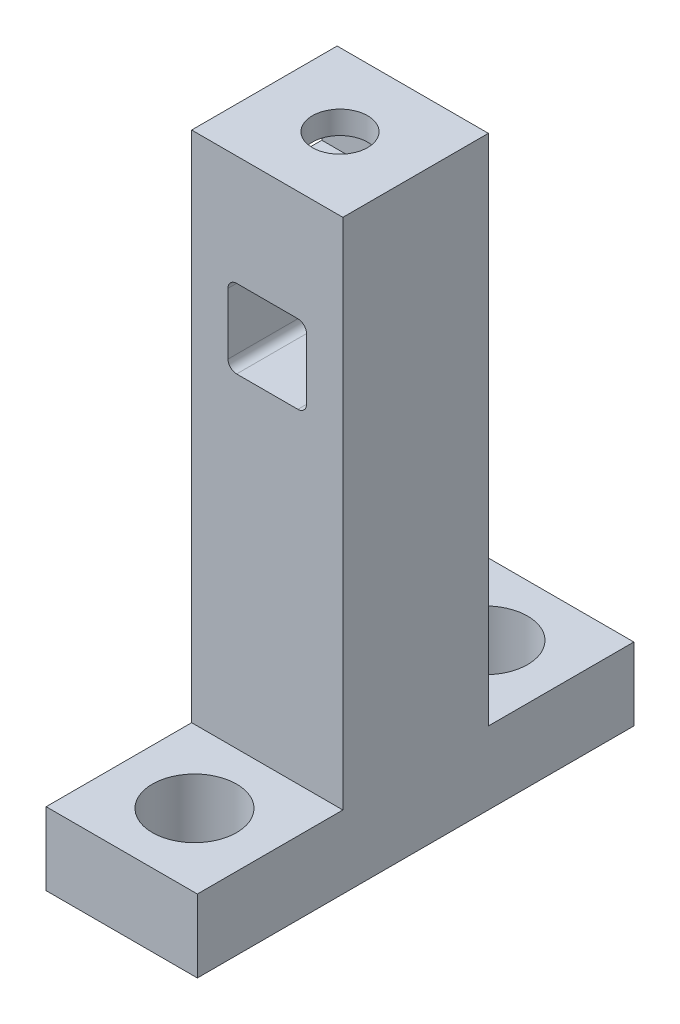
ISO-10303-21;
HEADER;
FILE_DESCRIPTION(('STEP AP214'),'2;1');
FILE_NAME('part.step','',(''),(''),'','','');
FILE_SCHEMA(('AUTOMOTIVE_DESIGN { 1 0 10303 214 1 1 1 1 }'));
ENDSEC;
DATA;
#1=APPLICATION_CONTEXT('core data for automotive mechanical design processes');
#2=APPLICATION_PROTOCOL_DEFINITION('international standard','automotive_design',2000,#1);
#3=PRODUCT_CONTEXT('',#1,'mechanical');
#4=PRODUCT('Part','Part','',(#3));
#5=PRODUCT_RELATED_PRODUCT_CATEGORY('part','',(#4));
#6=PRODUCT_DEFINITION_FORMATION('','',#4);
#7=PRODUCT_DEFINITION_CONTEXT('part definition',#1,'design');
#8=PRODUCT_DEFINITION('design','',#6,#7);
#9=PRODUCT_DEFINITION_SHAPE('','',#8);
#10=(LENGTH_UNIT() NAMED_UNIT(*) SI_UNIT(.MILLI.,.METRE.));
#11=(NAMED_UNIT(*) PLANE_ANGLE_UNIT() SI_UNIT($,.RADIAN.));
#12=(NAMED_UNIT(*) SI_UNIT($,.STERADIAN.) SOLID_ANGLE_UNIT());
#13=UNCERTAINTY_MEASURE_WITH_UNIT(LENGTH_MEASURE(1.E-05),#10,'distance_accuracy_value','');
#14=(GEOMETRIC_REPRESENTATION_CONTEXT(3) GLOBAL_UNCERTAINTY_ASSIGNED_CONTEXT((#13)) GLOBAL_UNIT_ASSIGNED_CONTEXT((#10,
#11,#12)) REPRESENTATION_CONTEXT('',''));
#15=CARTESIAN_POINT('',(0.,0.,0.));
#16=DIRECTION('',(0.,0.,1.));
#17=DIRECTION('',(1.,0.,0.));
#18=AXIS2_PLACEMENT_3D('',#15,#16,#17);
#19=CARTESIAN_POINT('',(-93.79,33.9649999439998,57.15));
#20=DIRECTION('',(0.,-1.,0.));
#21=DIRECTION('',(0.,0.,-1.));
#22=AXIS2_PLACEMENT_3D('',#19,#20,#21);
#23=PLANE('',#22);
#24=CARTESIAN_POINT('',(-87.19,33.9649999439998,50.8));
#25=DIRECTION('',(0.,-1.,0.));
#26=DIRECTION('',(0.,0.,-1.));
#27=AXIS2_PLACEMENT_3D('',#24,#25,#26);
#28=CIRCLE('',#27,2.41299999999999);
#29=CARTESIAN_POINT('',(-87.19,33.9649999439998,48.387));
#30=VERTEX_POINT('',#29);
#31=EDGE_CURVE('E242',#30,#30,#28,.T.);
#32=ORIENTED_EDGE('',*,*,#31,.T.);
#33=EDGE_LOOP('',(#32));
#34=FACE_BOUND('',#33,.T.);
#35=DIRECTION('',(-1.,0.,0.));
#36=VECTOR('',#35,1.);
#37=CARTESIAN_POINT('',(-93.79,33.9649999439998,55.8125));
#38=LINE('',#37,#36);
#39=CARTESIAN_POINT('',(-84.296031775687,33.9649999439998,55.8125));
#40=VERTEX_POINT('',#39);
#41=CARTESIAN_POINT('',(-93.79,33.9649999439998,55.8125));
#42=VERTEX_POINT('',#41);
#43=EDGE_CURVE('E261',#40,#42,#38,.T.);
#44=ORIENTED_EDGE('',*,*,#43,.F.);
#45=DIRECTION('',(-0.5,0.,0.866025403784439));
#46=VECTOR('',#45,1.);
#47=CARTESIAN_POINT('',(-84.296031775687,33.9649999439998,55.8125));
#48=LINE('',#47,#46);
#49=CARTESIAN_POINT('',(-81.402063551374,33.9649999439998,50.8));
#50=VERTEX_POINT('',#49);
#51=EDGE_CURVE('E266',#50,#40,#48,.T.);
#52=ORIENTED_EDGE('',*,*,#51,.F.);
#53=DIRECTION('',(0.500000000000001,0.,0.866025403784438));
#54=VECTOR('',#53,1.);
#55=CARTESIAN_POINT('',(-81.402063551374,33.9649999439998,50.8));
#56=LINE('',#55,#54);
#57=CARTESIAN_POINT('',(-84.296031775687,33.9649999439998,45.7875));
#58=VERTEX_POINT('',#57);
#59=EDGE_CURVE('E270',#58,#50,#56,.T.);
#60=ORIENTED_EDGE('',*,*,#59,.F.);
#61=DIRECTION('',(1.,0.,0.));
#62=VECTOR('',#61,1.);
#63=CARTESIAN_POINT('',(-84.296031775687,33.9649999439998,45.7875));
#64=LINE('',#63,#62);
#65=CARTESIAN_POINT('',(-93.79,33.9649999439998,45.7875));
#66=VERTEX_POINT('',#65);
#67=EDGE_CURVE('E274',#66,#58,#64,.T.);
#68=ORIENTED_EDGE('',*,*,#67,.F.);
#69=DIRECTION('',(0.,0.,-1.));
#70=VECTOR('',#69,1.);
#71=CARTESIAN_POINT('',(-93.79,33.9649999439998,57.15));
#72=LINE('',#71,#70);
#73=EDGE_CURVE('E11',#42,#66,#72,.T.);
#74=ORIENTED_EDGE('',*,*,#73,.F.);
#75=EDGE_LOOP('',(#44,#52,#60,#68,#74));
#76=FACE_BOUND('',#75,.T.);
#77=ADVANCED_FACE('F37',(#34,#76),#23,.F.);
#78=CARTESIAN_POINT('',(0.,0.,57.15));
#79=DIRECTION('',(0.,0.,1.));
#80=DIRECTION('',(1.,0.,0.));
#81=AXIS2_PLACEMENT_3D('',#78,#79,#80);
#82=PLANE('',#81);
#83=DIRECTION('',(-1.,0.,0.));
#84=VECTOR('',#83,1.);
#85=CARTESIAN_POINT('',(0.,-4.38500005600001,57.15));
#86=LINE('',#85,#84);
#87=CARTESIAN_POINT('',(-80.5899999999999,-4.38500005600001,57.15));
#88=VERTEX_POINT('',#87);
#89=CARTESIAN_POINT('',(-93.79,-4.38500005600001,57.15));
#90=VERTEX_POINT('',#89);
#91=EDGE_CURVE('E54',#88,#90,#86,.T.);
#92=ORIENTED_EDGE('',*,*,#91,.F.);
#93=DIRECTION('',(0.,1.,0.));
#94=VECTOR('',#93,1.);
#95=CARTESIAN_POINT('',(-80.59,33.9649999439998,57.15));
#96=LINE('',#95,#94);
#97=CARTESIAN_POINT('',(-80.59,40.4178749439998,57.15));
#98=VERTEX_POINT('',#97);
#99=EDGE_CURVE('E187',#88,#98,#96,.T.);
#100=ORIENTED_EDGE('',*,*,#99,.T.);
#101=DIRECTION('',(1.,0.,0.));
#102=VECTOR('',#101,1.);
#103=CARTESIAN_POINT('',(-93.79,40.4178749439998,57.15));
#104=LINE('',#103,#102);
#105=CARTESIAN_POINT('',(-93.79,40.4178749439998,57.15));
#106=VERTEX_POINT('',#105);
#107=EDGE_CURVE('E249',#106,#98,#104,.T.);
#108=ORIENTED_EDGE('',*,*,#107,.F.);
#109=DIRECTION('',(0.,-1.,0.));
#110=VECTOR('',#109,1.);
#111=CARTESIAN_POINT('',(-93.79,33.9649999439998,57.15));
#112=LINE('',#111,#110);
#113=EDGE_CURVE('E46',#106,#90,#112,.T.);
#114=ORIENTED_EDGE('',*,*,#113,.T.);
#115=EDGE_LOOP('',(#92,#100,#108,#114));
#116=FACE_BOUND('',#115,.T.);
#117=DIRECTION('',(1.,0.,0.));
#118=VECTOR('',#117,1.);
#119=CARTESIAN_POINT('',(-89.865,23.939999944,57.15));
#120=LINE('',#119,#118);
#121=CARTESIAN_POINT('',(-89.865,23.939999944,57.15));
#122=VERTEX_POINT('',#121);
#123=CARTESIAN_POINT('',(-84.515,23.939999944,57.15));
#124=VERTEX_POINT('',#123);
#125=EDGE_CURVE('E302',#122,#124,#120,.T.);
#126=ORIENTED_EDGE('',*,*,#125,.F.);
#127=CARTESIAN_POINT('',(-89.865,24.689999944,57.15));
#128=DIRECTION('',(0.,0.,1.));
#129=DIRECTION('',(1.,0.,0.));
#130=AXIS2_PLACEMENT_3D('',#127,#128,#129);
#131=CIRCLE('',#130,0.749999999999994);
#132=CARTESIAN_POINT('',(-90.615,24.689999944,57.15));
#133=VERTEX_POINT('',#132);
#134=EDGE_CURVE('E300',#133,#122,#131,.T.);
#135=ORIENTED_EDGE('',*,*,#134,.F.);
#136=DIRECTION('',(0.,-1.,0.));
#137=VECTOR('',#136,1.);
#138=CARTESIAN_POINT('',(-90.615,30.039999944,57.15));
#139=LINE('',#138,#137);
#140=CARTESIAN_POINT('',(-90.615,30.039999944,57.15));
#141=VERTEX_POINT('',#140);
#142=EDGE_CURVE('E316',#141,#133,#139,.T.);
#143=ORIENTED_EDGE('',*,*,#142,.F.);
#144=CARTESIAN_POINT('',(-89.865,30.039999944,57.15));
#145=DIRECTION('',(0.,0.,1.));
#146=DIRECTION('',(1.,0.,0.));
#147=AXIS2_PLACEMENT_3D('',#144,#145,#146);
#148=CIRCLE('',#147,0.750000000000001);
#149=CARTESIAN_POINT('',(-89.865,30.789999944,57.15));
#150=VERTEX_POINT('',#149);
#151=EDGE_CURVE('E313',#150,#141,#148,.T.);
#152=ORIENTED_EDGE('',*,*,#151,.F.);
#153=DIRECTION('',(-1.,0.,0.));
#154=VECTOR('',#153,1.);
#155=CARTESIAN_POINT('',(-84.515,30.789999944,57.15));
#156=LINE('',#155,#154);
#157=CARTESIAN_POINT('',(-84.515,30.789999944,57.15));
#158=VERTEX_POINT('',#157);
#159=EDGE_CURVE('E311',#158,#150,#156,.T.);
#160=ORIENTED_EDGE('',*,*,#159,.F.);
#161=CARTESIAN_POINT('',(-84.515,30.039999944,57.15));
#162=DIRECTION('',(0.,0.,1.));
#163=DIRECTION('',(1.,0.,0.));
#164=AXIS2_PLACEMENT_3D('',#161,#162,#163);
#165=CIRCLE('',#164,0.750000000000001);
#166=CARTESIAN_POINT('',(-83.765,30.039999944,57.15));
#167=VERTEX_POINT('',#166);
#168=EDGE_CURVE('E309',#167,#158,#165,.T.);
#169=ORIENTED_EDGE('',*,*,#168,.F.);
#170=DIRECTION('',(0.,1.,0.));
#171=VECTOR('',#170,1.);
#172=CARTESIAN_POINT('',(-83.765,24.689999944,57.15));
#173=LINE('',#172,#171);
#174=CARTESIAN_POINT('',(-83.765,24.689999944,57.15));
#175=VERTEX_POINT('',#174);
#176=EDGE_CURVE('E307',#175,#167,#173,.T.);
#177=ORIENTED_EDGE('',*,*,#176,.F.);
#178=CARTESIAN_POINT('',(-84.515,24.689999944,57.15));
#179=DIRECTION('',(0.,0.,1.));
#180=DIRECTION('',(1.,0.,0.));
#181=AXIS2_PLACEMENT_3D('',#178,#179,#180);
#182=CIRCLE('',#181,0.750000000000001);
#183=EDGE_CURVE('E305',#124,#175,#182,.T.);
#184=ORIENTED_EDGE('',*,*,#183,.F.);
#185=EDGE_LOOP('',(#126,#135,#143,#152,#160,#169,#177,#184));
#186=FACE_BOUND('',#185,.T.);
#187=ADVANCED_FACE('F390',(#116,#186),#82,.T.);
#188=CARTESIAN_POINT('',(0.,0.,44.45));
#189=DIRECTION('',(0.,0.,1.));
#190=DIRECTION('',(1.,0.,0.));
#191=AXIS2_PLACEMENT_3D('',#188,#189,#190);
#192=PLANE('',#191);
#193=DIRECTION('',(0.,1.,0.));
#194=VECTOR('',#193,1.);
#195=CARTESIAN_POINT('',(-80.59,33.9649999439998,44.45));
#196=LINE('',#195,#194);
#197=CARTESIAN_POINT('',(-80.5899999999999,-4.38500005600001,44.45));
#198=VERTEX_POINT('',#197);
#199=CARTESIAN_POINT('',(-80.59,40.4178749439998,44.45));
#200=VERTEX_POINT('',#199);
#201=EDGE_CURVE('E62',#198,#200,#196,.T.);
#202=ORIENTED_EDGE('',*,*,#201,.F.);
#203=DIRECTION('',(-1.,0.,0.));
#204=VECTOR('',#203,1.);
#205=CARTESIAN_POINT('',(0.,-4.38500005600002,44.45));
#206=LINE('',#205,#204);
#207=CARTESIAN_POINT('',(-93.79,-4.38500005600001,44.45));
#208=VERTEX_POINT('',#207);
#209=EDGE_CURVE('E222',#198,#208,#206,.T.);
#210=ORIENTED_EDGE('',*,*,#209,.T.);
#211=DIRECTION('',(0.,-1.,0.));
#212=VECTOR('',#211,1.);
#213=CARTESIAN_POINT('',(-93.79,33.9649999439998,44.45));
#214=LINE('',#213,#212);
#215=CARTESIAN_POINT('',(-93.79,40.4178749439998,44.45));
#216=VERTEX_POINT('',#215);
#217=EDGE_CURVE('E359',#216,#208,#214,.T.);
#218=ORIENTED_EDGE('',*,*,#217,.F.);
#219=DIRECTION('',(-1.,0.,0.));
#220=VECTOR('',#219,1.);
#221=CARTESIAN_POINT('',(-80.59,40.4178749439998,44.45));
#222=LINE('',#221,#220);
#223=EDGE_CURVE('E255',#200,#216,#222,.T.);
#224=ORIENTED_EDGE('',*,*,#223,.F.);
#225=EDGE_LOOP('',(#202,#210,#218,#224));
#226=FACE_BOUND('',#225,.T.);
#227=CARTESIAN_POINT('',(-89.865,24.689999944,44.45));
#228=DIRECTION('',(0.,0.,1.));
#229=DIRECTION('',(1.,0.,0.));
#230=AXIS2_PLACEMENT_3D('',#227,#228,#229);
#231=CIRCLE('',#230,0.749999999999994);
#232=CARTESIAN_POINT('',(-90.615,24.689999944,44.45));
#233=VERTEX_POINT('',#232);
#234=CARTESIAN_POINT('',(-89.865,23.939999944,44.45));
#235=VERTEX_POINT('',#234);
#236=EDGE_CURVE('E280',#233,#235,#231,.T.);
#237=ORIENTED_EDGE('',*,*,#236,.T.);
#238=DIRECTION('',(1.,0.,0.));
#239=VECTOR('',#238,1.);
#240=CARTESIAN_POINT('',(-89.865,23.939999944,44.45));
#241=LINE('',#240,#239);
#242=CARTESIAN_POINT('',(-84.515,23.939999944,44.45));
#243=VERTEX_POINT('',#242);
#244=EDGE_CURVE('E321',#235,#243,#241,.T.);
#245=ORIENTED_EDGE('',*,*,#244,.T.);
#246=CARTESIAN_POINT('',(-84.515,24.689999944,44.45));
#247=DIRECTION('',(0.,0.,1.));
#248=DIRECTION('',(1.,0.,0.));
#249=AXIS2_PLACEMENT_3D('',#246,#247,#248);
#250=CIRCLE('',#249,0.750000000000001);
#251=CARTESIAN_POINT('',(-83.765,24.689999944,44.45));
#252=VERTEX_POINT('',#251);
#253=EDGE_CURVE('E324',#243,#252,#250,.T.);
#254=ORIENTED_EDGE('',*,*,#253,.T.);
#255=DIRECTION('',(0.,1.,0.));
#256=VECTOR('',#255,1.);
#257=CARTESIAN_POINT('',(-83.765,24.689999944,44.45));
#258=LINE('',#257,#256);
#259=CARTESIAN_POINT('',(-83.765,30.039999944,44.45));
#260=VERTEX_POINT('',#259);
#261=EDGE_CURVE('E327',#252,#260,#258,.T.);
#262=ORIENTED_EDGE('',*,*,#261,.T.);
#263=CARTESIAN_POINT('',(-84.515,30.039999944,44.45));
#264=DIRECTION('',(0.,0.,1.));
#265=DIRECTION('',(1.,0.,0.));
#266=AXIS2_PLACEMENT_3D('',#263,#264,#265);
#267=CIRCLE('',#266,0.750000000000001);
#268=CARTESIAN_POINT('',(-84.515,30.789999944,44.45));
#269=VERTEX_POINT('',#268);
#270=EDGE_CURVE('E330',#260,#269,#267,.T.);
#271=ORIENTED_EDGE('',*,*,#270,.T.);
#272=DIRECTION('',(-1.,0.,0.));
#273=VECTOR('',#272,1.);
#274=CARTESIAN_POINT('',(-84.515,30.789999944,44.45));
#275=LINE('',#274,#273);
#276=CARTESIAN_POINT('',(-89.865,30.789999944,44.45));
#277=VERTEX_POINT('',#276);
#278=EDGE_CURVE('E333',#269,#277,#275,.T.);
#279=ORIENTED_EDGE('',*,*,#278,.T.);
#280=CARTESIAN_POINT('',(-89.865,30.039999944,44.45));
#281=DIRECTION('',(0.,0.,1.));
#282=DIRECTION('',(1.,0.,0.));
#283=AXIS2_PLACEMENT_3D('',#280,#281,#282);
#284=CIRCLE('',#283,0.750000000000001);
#285=CARTESIAN_POINT('',(-90.615,30.039999944,44.45));
#286=VERTEX_POINT('',#285);
#287=EDGE_CURVE('E336',#277,#286,#284,.T.);
#288=ORIENTED_EDGE('',*,*,#287,.T.);
#289=DIRECTION('',(0.,-1.,0.));
#290=VECTOR('',#289,1.);
#291=CARTESIAN_POINT('',(-90.615,30.039999944,44.45));
#292=LINE('',#291,#290);
#293=EDGE_CURVE('E303',#286,#233,#292,.T.);
#294=ORIENTED_EDGE('',*,*,#293,.T.);
#295=EDGE_LOOP('',(#237,#245,#254,#262,#271,#279,#288,#294));
#296=FACE_BOUND('',#295,.T.);
#297=ADVANCED_FACE('F395',(#226,#296),#192,.F.);
#298=CARTESIAN_POINT('',(-80.59,33.9649999439998,57.15));
#299=DIRECTION('',(-1.,0.,0.));
#300=DIRECTION('',(0.,-1.,0.));
#301=AXIS2_PLACEMENT_3D('',#298,#299,#300);
#302=PLANE('',#301);
#303=ORIENTED_EDGE('',*,*,#99,.F.);
#304=DIRECTION('',(0.,0.,1.));
#305=VECTOR('',#304,1.);
#306=CARTESIAN_POINT('',(-80.59,-4.38500005600002,31.75));
#307=LINE('',#306,#305);
#308=CARTESIAN_POINT('',(-80.59,-4.38500005600001,69.85));
#309=VERTEX_POINT('',#308);
#310=EDGE_CURVE('E182',#88,#309,#307,.T.);
#311=ORIENTED_EDGE('',*,*,#310,.T.);
#312=DIRECTION('',(0.,-1.,0.));
#313=VECTOR('',#312,1.);
#314=CARTESIAN_POINT('',(-80.59,-4.38500005600001,69.85));
#315=LINE('',#314,#313);
#316=CARTESIAN_POINT('',(-80.59,-10.735000056,69.85));
#317=VERTEX_POINT('',#316);
#318=EDGE_CURVE('E184',#309,#317,#315,.T.);
#319=ORIENTED_EDGE('',*,*,#318,.T.);
#320=DIRECTION('',(0.,0.,-1.));
#321=VECTOR('',#320,1.);
#322=CARTESIAN_POINT('',(-80.59,-10.735000056,57.15));
#323=LINE('',#322,#321);
#324=CARTESIAN_POINT('',(-80.59,-10.735000056,31.75));
#325=VERTEX_POINT('',#324);
#326=EDGE_CURVE('E231',#317,#325,#323,.T.);
#327=ORIENTED_EDGE('',*,*,#326,.T.);
#328=DIRECTION('',(0.,-1.,0.));
#329=VECTOR('',#328,1.);
#330=CARTESIAN_POINT('',(-80.59,-4.38500005600002,31.75));
#331=LINE('',#330,#329);
#332=CARTESIAN_POINT('',(-80.59,-4.38500005600002,31.75));
#333=VERTEX_POINT('',#332);
#334=EDGE_CURVE('E219',#333,#325,#331,.T.);
#335=ORIENTED_EDGE('',*,*,#334,.F.);
#336=EDGE_CURVE('E190',#333,#198,#307,.T.);
#337=ORIENTED_EDGE('',*,*,#336,.T.);
#338=ORIENTED_EDGE('',*,*,#201,.T.);
#339=DIRECTION('',(0.,0.,-1.));
#340=VECTOR('',#339,1.);
#341=CARTESIAN_POINT('',(-80.59,40.4178749439998,57.15));
#342=LINE('',#341,#340);
#343=EDGE_CURVE('E252',#98,#200,#342,.T.);
#344=ORIENTED_EDGE('',*,*,#343,.F.);
#345=EDGE_LOOP('',(#303,#311,#319,#327,#335,#337,#338,#344));
#346=FACE_BOUND('',#345,.T.);
#347=ADVANCED_FACE('F39',(#346),#302,.F.);
#348=CARTESIAN_POINT('',(-93.79,33.9649999439998,57.15));
#349=DIRECTION('',(1.,0.,0.));
#350=DIRECTION('',(0.,0.,-1.));
#351=AXIS2_PLACEMENT_3D('',#348,#349,#350);
#352=PLANE('',#351);
#353=DIRECTION('',(0.,-1.,0.));
#354=VECTOR('',#353,1.);
#355=CARTESIAN_POINT('',(-93.79,57.2353529363436,45.7875));
#356=LINE('',#355,#354);
#357=CARTESIAN_POINT('',(-93.79,38.4178749439998,45.7875));
#358=VERTEX_POINT('',#357);
#359=EDGE_CURVE('E258',#358,#66,#356,.T.);
#360=ORIENTED_EDGE('',*,*,#359,.F.);
#361=DIRECTION('',(0.,0.,1.));
#362=VECTOR('',#361,1.);
#363=CARTESIAN_POINT('',(-93.79,38.4178749439998,44.45));
#364=LINE('',#363,#362);
#365=CARTESIAN_POINT('',(-93.79,38.4178749439998,55.8125));
#366=VERTEX_POINT('',#365);
#367=EDGE_CURVE('E245',#358,#366,#364,.T.);
#368=ORIENTED_EDGE('',*,*,#367,.T.);
#369=DIRECTION('',(0.,-1.,0.));
#370=VECTOR('',#369,1.);
#371=CARTESIAN_POINT('',(-93.79,57.2353529363436,55.8125));
#372=LINE('',#371,#370);
#373=EDGE_CURVE('E264',#366,#42,#372,.T.);
#374=ORIENTED_EDGE('',*,*,#373,.T.);
#375=ORIENTED_EDGE('',*,*,#73,.T.);
#376=EDGE_LOOP('',(#360,#368,#374,#375));
#377=FACE_BOUND('',#376,.T.);
#378=ORIENTED_EDGE('',*,*,#217,.T.);
#379=DIRECTION('',(0.,0.,-1.));
#380=VECTOR('',#379,1.);
#381=CARTESIAN_POINT('',(-93.79,-4.38500005600002,31.75));
#382=LINE('',#381,#380);
#383=CARTESIAN_POINT('',(-93.79,-4.38500005600002,31.75));
#384=VERTEX_POINT('',#383);
#385=EDGE_CURVE('E207',#208,#384,#382,.T.);
#386=ORIENTED_EDGE('',*,*,#385,.T.);
#387=DIRECTION('',(0.,-1.,0.));
#388=VECTOR('',#387,1.);
#389=CARTESIAN_POINT('',(-93.79,-4.38500005600002,31.75));
#390=LINE('',#389,#388);
#391=CARTESIAN_POINT('',(-93.79,-10.735000056,31.75));
#392=VERTEX_POINT('',#391);
#393=EDGE_CURVE('E223',#384,#392,#390,.T.);
#394=ORIENTED_EDGE('',*,*,#393,.T.);
#395=DIRECTION('',(0.,0.,1.));
#396=VECTOR('',#395,1.);
#397=CARTESIAN_POINT('',(-93.79,-10.735000056,57.15));
#398=LINE('',#397,#396);
#399=CARTESIAN_POINT('',(-93.79,-10.735000056,69.85));
#400=VERTEX_POINT('',#399);
#401=EDGE_CURVE('E229',#392,#400,#398,.T.);
#402=ORIENTED_EDGE('',*,*,#401,.T.);
#403=DIRECTION('',(0.,-1.,0.));
#404=VECTOR('',#403,1.);
#405=CARTESIAN_POINT('',(-93.79,-4.38500005600001,69.85));
#406=LINE('',#405,#404);
#407=CARTESIAN_POINT('',(-93.79,-4.38500005600001,69.85));
#408=VERTEX_POINT('',#407);
#409=EDGE_CURVE('E200',#408,#400,#406,.T.);
#410=ORIENTED_EDGE('',*,*,#409,.F.);
#411=EDGE_CURVE('E206',#408,#90,#382,.T.);
#412=ORIENTED_EDGE('',*,*,#411,.T.);
#413=ORIENTED_EDGE('',*,*,#113,.F.);
#414=DIRECTION('',(0.,0.,1.));
#415=VECTOR('',#414,1.);
#416=CARTESIAN_POINT('',(-93.79,40.4178749439998,44.45));
#417=LINE('',#416,#415);
#418=EDGE_CURVE('E246',#216,#106,#417,.T.);
#419=ORIENTED_EDGE('',*,*,#418,.F.);
#420=EDGE_LOOP('',(#378,#386,#394,#402,#410,#412,#413,#419));
#421=FACE_BOUND('',#420,.T.);
#422=ADVANCED_FACE('F399',(#377,#421),#352,.F.);
#423=CARTESIAN_POINT('',(-89.865,24.689999944,57.15));
#424=DIRECTION('',(0.,0.,-1.));
#425=DIRECTION('',(-1.,0.,0.));
#426=AXIS2_PLACEMENT_3D('',#423,#424,#425);
#427=CYLINDRICAL_SURFACE('',#426,0.749999999999994);
#428=ORIENTED_EDGE('',*,*,#236,.F.);
#429=DIRECTION('',(0.,0.,-1.));
#430=VECTOR('',#429,1.);
#431=CARTESIAN_POINT('',(-90.615,24.689999944,57.15));
#432=LINE('',#431,#430);
#433=EDGE_CURVE('E318',#133,#233,#432,.T.);
#434=ORIENTED_EDGE('',*,*,#433,.F.);
#435=ORIENTED_EDGE('',*,*,#134,.T.);
#436=DIRECTION('',(0.,0.,-1.));
#437=VECTOR('',#436,1.);
#438=CARTESIAN_POINT('',(-89.865,23.939999944,57.15));
#439=LINE('',#438,#437);
#440=EDGE_CURVE('E355',#122,#235,#439,.T.);
#441=ORIENTED_EDGE('',*,*,#440,.T.);
#442=EDGE_LOOP('',(#428,#434,#435,#441));
#443=FACE_BOUND('',#442,.T.);
#444=ADVANCED_FACE('F402',(#443),#427,.F.);
#445=CARTESIAN_POINT('',(-89.865,23.939999944,57.15));
#446=DIRECTION('',(0.,1.,0.));
#447=DIRECTION('',(0.,0.,1.));
#448=AXIS2_PLACEMENT_3D('',#445,#446,#447);
#449=PLANE('',#448);
#450=ORIENTED_EDGE('',*,*,#244,.F.);
#451=ORIENTED_EDGE('',*,*,#440,.F.);
#452=ORIENTED_EDGE('',*,*,#125,.T.);
#453=DIRECTION('',(0.,0.,-1.));
#454=VECTOR('',#453,1.);
#455=CARTESIAN_POINT('',(-84.515,23.939999944,57.15));
#456=LINE('',#455,#454);
#457=EDGE_CURVE('E353',#124,#243,#456,.T.);
#458=ORIENTED_EDGE('',*,*,#457,.T.);
#459=EDGE_LOOP('',(#450,#451,#452,#458));
#460=FACE_BOUND('',#459,.T.);
#461=ADVANCED_FACE('F408',(#460),#449,.T.);
#462=CARTESIAN_POINT('',(-84.515,24.689999944,57.15));
#463=DIRECTION('',(0.,0.,-1.));
#464=DIRECTION('',(-1.,0.,0.));
#465=AXIS2_PLACEMENT_3D('',#462,#463,#464);
#466=CYLINDRICAL_SURFACE('',#465,0.750000000000001);
#467=ORIENTED_EDGE('',*,*,#253,.F.);
#468=ORIENTED_EDGE('',*,*,#457,.F.);
#469=ORIENTED_EDGE('',*,*,#183,.T.);
#470=DIRECTION('',(0.,0.,-1.));
#471=VECTOR('',#470,1.);
#472=CARTESIAN_POINT('',(-83.765,24.689999944,57.15));
#473=LINE('',#472,#471);
#474=EDGE_CURVE('E351',#175,#252,#473,.T.);
#475=ORIENTED_EDGE('',*,*,#474,.T.);
#476=EDGE_LOOP('',(#467,#468,#469,#475));
#477=FACE_BOUND('',#476,.T.);
#478=ADVANCED_FACE('F412',(#477),#466,.F.);
#479=CARTESIAN_POINT('',(-83.765,24.689999944,57.15));
#480=DIRECTION('',(-1.,0.,0.));
#481=DIRECTION('',(0.,0.,1.));
#482=AXIS2_PLACEMENT_3D('',#479,#480,#481);
#483=PLANE('',#482);
#484=ORIENTED_EDGE('',*,*,#261,.F.);
#485=ORIENTED_EDGE('',*,*,#474,.F.);
#486=ORIENTED_EDGE('',*,*,#176,.T.);
#487=DIRECTION('',(0.,0.,-1.));
#488=VECTOR('',#487,1.);
#489=CARTESIAN_POINT('',(-83.765,30.039999944,57.15));
#490=LINE('',#489,#488);
#491=EDGE_CURVE('E349',#167,#260,#490,.T.);
#492=ORIENTED_EDGE('',*,*,#491,.T.);
#493=EDGE_LOOP('',(#484,#485,#486,#492));
#494=FACE_BOUND('',#493,.T.);
#495=ADVANCED_FACE('F416',(#494),#483,.T.);
#496=CARTESIAN_POINT('',(-84.515,30.039999944,57.15));
#497=DIRECTION('',(0.,0.,-1.));
#498=DIRECTION('',(-1.,0.,0.));
#499=AXIS2_PLACEMENT_3D('',#496,#497,#498);
#500=CYLINDRICAL_SURFACE('',#499,0.750000000000001);
#501=ORIENTED_EDGE('',*,*,#270,.F.);
#502=ORIENTED_EDGE('',*,*,#491,.F.);
#503=ORIENTED_EDGE('',*,*,#168,.T.);
#504=DIRECTION('',(0.,0.,-1.));
#505=VECTOR('',#504,1.);
#506=CARTESIAN_POINT('',(-84.515,30.789999944,57.15));
#507=LINE('',#506,#505);
#508=EDGE_CURVE('E347',#158,#269,#507,.T.);
#509=ORIENTED_EDGE('',*,*,#508,.T.);
#510=EDGE_LOOP('',(#501,#502,#503,#509));
#511=FACE_BOUND('',#510,.T.);
#512=ADVANCED_FACE('F420',(#511),#500,.F.);
#513=CARTESIAN_POINT('',(-84.515,30.789999944,57.15));
#514=DIRECTION('',(0.,-1.,0.));
#515=DIRECTION('',(0.,0.,-1.));
#516=AXIS2_PLACEMENT_3D('',#513,#514,#515);
#517=PLANE('',#516);
#518=CARTESIAN_POINT('',(-87.19,30.789999944,50.8));
#519=DIRECTION('',(0.,-1.,0.));
#520=DIRECTION('',(0.,0.,-1.));
#521=AXIS2_PLACEMENT_3D('',#518,#519,#520);
#522=CIRCLE('',#521,2.41299999999999);
#523=CARTESIAN_POINT('',(-87.19,30.789999944,48.387));
#524=VERTEX_POINT('',#523);
#525=EDGE_CURVE('E239',#524,#524,#522,.T.);
#526=ORIENTED_EDGE('',*,*,#525,.F.);
#527=EDGE_LOOP('',(#526));
#528=FACE_BOUND('',#527,.T.);
#529=ORIENTED_EDGE('',*,*,#278,.F.);
#530=ORIENTED_EDGE('',*,*,#508,.F.);
#531=ORIENTED_EDGE('',*,*,#159,.T.);
#532=DIRECTION('',(0.,0.,-1.));
#533=VECTOR('',#532,1.);
#534=CARTESIAN_POINT('',(-89.865,30.789999944,57.15));
#535=LINE('',#534,#533);
#536=EDGE_CURVE('E345',#150,#277,#535,.T.);
#537=ORIENTED_EDGE('',*,*,#536,.T.);
#538=EDGE_LOOP('',(#529,#530,#531,#537));
#539=FACE_BOUND('',#538,.T.);
#540=ADVANCED_FACE('F424',(#528,#539),#517,.T.);
#541=CARTESIAN_POINT('',(-89.865,30.039999944,57.15));
#542=DIRECTION('',(0.,0.,-1.));
#543=DIRECTION('',(-1.,0.,0.));
#544=AXIS2_PLACEMENT_3D('',#541,#542,#543);
#545=CYLINDRICAL_SURFACE('',#544,0.750000000000001);
#546=ORIENTED_EDGE('',*,*,#287,.F.);
#547=ORIENTED_EDGE('',*,*,#536,.F.);
#548=ORIENTED_EDGE('',*,*,#151,.T.);
#549=DIRECTION('',(0.,0.,-1.));
#550=VECTOR('',#549,1.);
#551=CARTESIAN_POINT('',(-90.615,30.039999944,57.15));
#552=LINE('',#551,#550);
#553=EDGE_CURVE('E343',#141,#286,#552,.T.);
#554=ORIENTED_EDGE('',*,*,#553,.T.);
#555=EDGE_LOOP('',(#546,#547,#548,#554));
#556=FACE_BOUND('',#555,.T.);
#557=ADVANCED_FACE('F428',(#556),#545,.F.);
#558=CARTESIAN_POINT('',(-90.615,30.039999944,57.15));
#559=DIRECTION('',(1.,0.,0.));
#560=DIRECTION('',(0.,1.,0.));
#561=AXIS2_PLACEMENT_3D('',#558,#559,#560);
#562=PLANE('',#561);
#563=ORIENTED_EDGE('',*,*,#293,.F.);
#564=ORIENTED_EDGE('',*,*,#553,.F.);
#565=ORIENTED_EDGE('',*,*,#142,.T.);
#566=ORIENTED_EDGE('',*,*,#433,.T.);
#567=EDGE_LOOP('',(#563,#564,#565,#566));
#568=FACE_BOUND('',#567,.T.);
#569=ADVANCED_FACE('F432',(#568),#562,.T.);
#570=CARTESIAN_POINT('',(-84.296031775687,57.2353529363436,45.7875));
#571=DIRECTION('',(0.,0.,-1.));
#572=DIRECTION('',(-1.,0.,0.));
#573=AXIS2_PLACEMENT_3D('',#570,#571,#572);
#574=PLANE('',#573);
#575=DIRECTION('',(1.,0.,0.));
#576=VECTOR('',#575,1.);
#577=CARTESIAN_POINT('',(-84.296031775687,38.4178749439998,45.7875));
#578=LINE('',#577,#576);
#579=CARTESIAN_POINT('',(-84.296031775687,38.4178749439998,45.7875));
#580=VERTEX_POINT('',#579);
#581=EDGE_CURVE('E287',#358,#580,#578,.T.);
#582=ORIENTED_EDGE('',*,*,#581,.F.);
#583=ORIENTED_EDGE('',*,*,#359,.T.);
#584=ORIENTED_EDGE('',*,*,#67,.T.);
#585=DIRECTION('',(0.,-1.,0.));
#586=VECTOR('',#585,1.);
#587=CARTESIAN_POINT('',(-84.296031775687,57.2353529363436,45.7875));
#588=LINE('',#587,#586);
#589=EDGE_CURVE('E273',#580,#58,#588,.T.);
#590=ORIENTED_EDGE('',*,*,#589,.F.);
#591=EDGE_LOOP('',(#582,#583,#584,#590));
#592=FACE_BOUND('',#591,.T.);
#593=ADVANCED_FACE('F436',(#592),#574,.F.);
#594=CARTESIAN_POINT('',(-81.402063551374,57.2353529363436,50.8));
#595=DIRECTION('',(0.866025403784438,0.,-0.500000000000001));
#596=DIRECTION('',(-0.500000000000001,0.,-0.866025403784438));
#597=AXIS2_PLACEMENT_3D('',#594,#595,#596);
#598=PLANE('',#597);
#599=DIRECTION('',(0.500000000000001,0.,0.866025403784438));
#600=VECTOR('',#599,1.);
#601=CARTESIAN_POINT('',(-81.402063551374,38.4178749439998,50.8));
#602=LINE('',#601,#600);
#603=CARTESIAN_POINT('',(-81.402063551374,38.4178749439998,50.8));
#604=VERTEX_POINT('',#603);
#605=EDGE_CURVE('E284',#580,#604,#602,.T.);
#606=ORIENTED_EDGE('',*,*,#605,.F.);
#607=ORIENTED_EDGE('',*,*,#589,.T.);
#608=ORIENTED_EDGE('',*,*,#59,.T.);
#609=DIRECTION('',(0.,-1.,0.));
#610=VECTOR('',#609,1.);
#611=CARTESIAN_POINT('',(-81.402063551374,57.2353529363436,50.8));
#612=LINE('',#611,#610);
#613=EDGE_CURVE('E269',#604,#50,#612,.T.);
#614=ORIENTED_EDGE('',*,*,#613,.F.);
#615=EDGE_LOOP('',(#606,#607,#608,#614));
#616=FACE_BOUND('',#615,.T.);
#617=ADVANCED_FACE('F440',(#616),#598,.F.);
#618=CARTESIAN_POINT('',(-84.296031775687,57.2353529363436,55.8125));
#619=DIRECTION('',(0.866025403784439,0.,0.5));
#620=DIRECTION('',(0.5,0.,-0.866025403784439));
#621=AXIS2_PLACEMENT_3D('',#618,#619,#620);
#622=PLANE('',#621);
#623=DIRECTION('',(-0.5,0.,0.866025403784439));
#624=VECTOR('',#623,1.);
#625=CARTESIAN_POINT('',(-84.296031775687,38.4178749439998,55.8125));
#626=LINE('',#625,#624);
#627=CARTESIAN_POINT('',(-84.296031775687,38.4178749439998,55.8125));
#628=VERTEX_POINT('',#627);
#629=EDGE_CURVE('E281',#604,#628,#626,.T.);
#630=ORIENTED_EDGE('',*,*,#629,.F.);
#631=ORIENTED_EDGE('',*,*,#613,.T.);
#632=ORIENTED_EDGE('',*,*,#51,.T.);
#633=DIRECTION('',(0.,-1.,0.));
#634=VECTOR('',#633,1.);
#635=CARTESIAN_POINT('',(-84.296031775687,57.2353529363436,55.8125));
#636=LINE('',#635,#634);
#637=EDGE_CURVE('E265',#628,#40,#636,.T.);
#638=ORIENTED_EDGE('',*,*,#637,.F.);
#639=EDGE_LOOP('',(#630,#631,#632,#638));
#640=FACE_BOUND('',#639,.T.);
#641=ADVANCED_FACE('F444',(#640),#622,.F.);
#642=CARTESIAN_POINT('',(-93.79,57.2353529363436,55.8125));
#643=DIRECTION('',(0.,0.,1.));
#644=DIRECTION('',(1.,0.,0.));
#645=AXIS2_PLACEMENT_3D('',#642,#643,#644);
#646=PLANE('',#645);
#647=DIRECTION('',(-1.,0.,0.));
#648=VECTOR('',#647,1.);
#649=CARTESIAN_POINT('',(-93.79,38.4178749439998,55.8125));
#650=LINE('',#649,#648);
#651=EDGE_CURVE('E277',#628,#366,#650,.T.);
#652=ORIENTED_EDGE('',*,*,#651,.F.);
#653=ORIENTED_EDGE('',*,*,#637,.T.);
#654=ORIENTED_EDGE('',*,*,#43,.T.);
#655=ORIENTED_EDGE('',*,*,#373,.F.);
#656=EDGE_LOOP('',(#652,#653,#654,#655));
#657=FACE_BOUND('',#656,.T.);
#658=ADVANCED_FACE('F448',(#657),#646,.F.);
#659=CARTESIAN_POINT('',(0.,38.4178749439998,0.));
#660=DIRECTION('',(0.,1.,0.));
#661=DIRECTION('',(0.,0.,1.));
#662=AXIS2_PLACEMENT_3D('',#659,#660,#661);
#663=PLANE('',#662);
#664=CARTESIAN_POINT('',(-87.19,38.4178749439998,50.8));
#665=DIRECTION('',(0.,1.,0.));
#666=DIRECTION('',(0.,0.,1.));
#667=AXIS2_PLACEMENT_3D('',#664,#665,#666);
#668=CIRCLE('',#667,2.41299999999999);
#669=CARTESIAN_POINT('',(-87.19,38.4178749439998,53.213));
#670=VERTEX_POINT('',#669);
#671=EDGE_CURVE('E236',#670,#670,#668,.T.);
#672=ORIENTED_EDGE('',*,*,#671,.T.);
#673=EDGE_LOOP('',(#672));
#674=FACE_BOUND('',#673,.T.);
#675=ORIENTED_EDGE('',*,*,#367,.F.);
#676=ORIENTED_EDGE('',*,*,#581,.T.);
#677=ORIENTED_EDGE('',*,*,#605,.T.);
#678=ORIENTED_EDGE('',*,*,#629,.T.);
#679=ORIENTED_EDGE('',*,*,#651,.T.);
#680=EDGE_LOOP('',(#675,#676,#677,#678,#679));
#681=FACE_BOUND('',#680,.T.);
#682=ADVANCED_FACE('F452',(#674,#681),#663,.F.);
#683=CARTESIAN_POINT('',(0.,40.4178749439998,0.));
#684=DIRECTION('',(0.,1.,0.));
#685=DIRECTION('',(0.,0.,1.));
#686=AXIS2_PLACEMENT_3D('',#683,#684,#685);
#687=PLANE('',#686);
#688=CARTESIAN_POINT('',(-87.19,40.4178749439998,50.8));
#689=DIRECTION('',(0.,1.,0.));
#690=DIRECTION('',(0.,0.,1.));
#691=AXIS2_PLACEMENT_3D('',#688,#689,#690);
#692=CIRCLE('',#691,2.41299999999999);
#693=CARTESIAN_POINT('',(-87.19,40.4178749439998,53.213));
#694=VERTEX_POINT('',#693);
#695=EDGE_CURVE('E233',#694,#694,#692,.T.);
#696=ORIENTED_EDGE('',*,*,#695,.F.);
#697=EDGE_LOOP('',(#696));
#698=FACE_BOUND('',#697,.T.);
#699=ORIENTED_EDGE('',*,*,#418,.T.);
#700=ORIENTED_EDGE('',*,*,#107,.T.);
#701=ORIENTED_EDGE('',*,*,#343,.T.);
#702=ORIENTED_EDGE('',*,*,#223,.T.);
#703=EDGE_LOOP('',(#699,#700,#701,#702));
#704=FACE_BOUND('',#703,.T.);
#705=ADVANCED_FACE('F456',(#698,#704),#687,.T.);
#706=CARTESIAN_POINT('',(-87.19,23.7150052919874,50.8));
#707=DIRECTION('',(0.,1.,0.));
#708=DIRECTION('',(0.,0.,1.));
#709=AXIS2_PLACEMENT_3D('',#706,#707,#708);
#710=CYLINDRICAL_SURFACE('',#709,2.41299999999999);
#711=ORIENTED_EDGE('',*,*,#695,.T.);
#712=EDGE_LOOP('',(#711));
#713=FACE_BOUND('',#712,.T.);
#714=ORIENTED_EDGE('',*,*,#671,.F.);
#715=EDGE_LOOP('',(#714));
#716=FACE_BOUND('',#715,.T.);
#717=ADVANCED_FACE('F460',(#713,#716),#710,.F.);
#718=ORIENTED_EDGE('',*,*,#525,.T.);
#719=EDGE_LOOP('',(#718));
#720=FACE_BOUND('',#719,.T.);
#721=ORIENTED_EDGE('',*,*,#31,.F.);
#722=EDGE_LOOP('',(#721));
#723=FACE_BOUND('',#722,.T.);
#724=ADVANCED_FACE('F462',(#720,#723),#710,.F.);
#725=CARTESIAN_POINT('',(-83.2946703375213,-10.735000056,-24.4418244148077));
#726=DIRECTION('',(0.,1.,0.));
#727=DIRECTION('',(0.,0.,1.));
#728=AXIS2_PLACEMENT_3D('',#725,#726,#727);
#729=PLANE('',#728);
#730=CARTESIAN_POINT('',(-87.19,-10.735000056,63.5));
#731=DIRECTION('',(0.,1.,0.));
#732=DIRECTION('',(0.,0.,1.));
#733=AXIS2_PLACEMENT_3D('',#730,#731,#732);
#734=CIRCLE('',#733,3.675);
#735=CARTESIAN_POINT('',(-87.19,-10.735000056,67.175));
#736=VERTEX_POINT('',#735);
#737=EDGE_CURVE('E365',#736,#736,#734,.T.);
#738=ORIENTED_EDGE('',*,*,#737,.T.);
#739=EDGE_LOOP('',(#738));
#740=FACE_BOUND('',#739,.T.);
#741=CARTESIAN_POINT('',(-87.19,-10.735000056,38.1));
#742=DIRECTION('',(0.,1.,0.));
#743=DIRECTION('',(0.,0.,1.));
#744=AXIS2_PLACEMENT_3D('',#741,#742,#743);
#745=CIRCLE('',#744,3.675);
#746=CARTESIAN_POINT('',(-87.19,-10.735000056,41.775));
#747=VERTEX_POINT('',#746);
#748=EDGE_CURVE('E216',#747,#747,#745,.T.);
#749=ORIENTED_EDGE('',*,*,#748,.T.);
#750=EDGE_LOOP('',(#749));
#751=FACE_BOUND('',#750,.T.);
#752=ORIENTED_EDGE('',*,*,#326,.F.);
#753=DIRECTION('',(-1.,0.,0.));
#754=VECTOR('',#753,1.);
#755=CARTESIAN_POINT('',(-93.79,-10.735000056,69.85));
#756=LINE('',#755,#754);
#757=EDGE_CURVE('E199',#317,#400,#756,.T.);
#758=ORIENTED_EDGE('',*,*,#757,.T.);
#759=ORIENTED_EDGE('',*,*,#401,.F.);
#760=DIRECTION('',(1.,0.,0.));
#761=VECTOR('',#760,1.);
#762=CARTESIAN_POINT('',(-93.79,-10.735000056,31.75));
#763=LINE('',#762,#761);
#764=EDGE_CURVE('E191',#392,#325,#763,.T.);
#765=ORIENTED_EDGE('',*,*,#764,.T.);
#766=EDGE_LOOP('',(#752,#758,#759,#765));
#767=FACE_BOUND('',#766,.T.);
#768=ADVANCED_FACE('F376',(#740,#751,#767),#729,.F.);
#769=CARTESIAN_POINT('',(-93.79,-4.38500005600002,31.75));
#770=DIRECTION('',(0.,0.,-1.));
#771=DIRECTION('',(0.,1.,0.));
#772=AXIS2_PLACEMENT_3D('',#769,#770,#771);
#773=PLANE('',#772);
#774=ORIENTED_EDGE('',*,*,#764,.F.);
#775=ORIENTED_EDGE('',*,*,#393,.F.);
#776=DIRECTION('',(1.,0.,0.));
#777=VECTOR('',#776,1.);
#778=CARTESIAN_POINT('',(-93.79,-4.38500005600002,31.75));
#779=LINE('',#778,#777);
#780=EDGE_CURVE('E201',#384,#333,#779,.T.);
#781=ORIENTED_EDGE('',*,*,#780,.T.);
#782=ORIENTED_EDGE('',*,*,#334,.T.);
#783=EDGE_LOOP('',(#774,#775,#781,#782));
#784=FACE_BOUND('',#783,.T.);
#785=ADVANCED_FACE('F468',(#784),#773,.T.);
#786=CARTESIAN_POINT('',(0.,-4.38500005600002,0.));
#787=DIRECTION('',(0.,1.,0.));
#788=DIRECTION('',(0.,0.,1.));
#789=AXIS2_PLACEMENT_3D('',#786,#787,#788);
#790=PLANE('',#789);
#791=CARTESIAN_POINT('',(-87.19,-4.38500005600002,38.1));
#792=DIRECTION('',(0.,1.,0.));
#793=DIRECTION('',(0.,0.,1.));
#794=AXIS2_PLACEMENT_3D('',#791,#792,#793);
#795=CIRCLE('',#794,3.675);
#796=CARTESIAN_POINT('',(-87.19,-4.38500005600002,41.775));
#797=VERTEX_POINT('',#796);
#798=EDGE_CURVE('E41',#797,#797,#795,.T.);
#799=ORIENTED_EDGE('',*,*,#798,.F.);
#800=EDGE_LOOP('',(#799));
#801=FACE_BOUND('',#800,.T.);
#802=ORIENTED_EDGE('',*,*,#209,.F.);
#803=ORIENTED_EDGE('',*,*,#336,.F.);
#804=ORIENTED_EDGE('',*,*,#780,.F.);
#805=ORIENTED_EDGE('',*,*,#385,.F.);
#806=EDGE_LOOP('',(#802,#803,#804,#805));
#807=FACE_BOUND('',#806,.T.);
#808=ADVANCED_FACE('F471',(#801,#807),#790,.T.);
#809=CARTESIAN_POINT('',(-93.79,-4.38500005600001,69.85));
#810=DIRECTION('',(0.,0.,1.));
#811=DIRECTION('',(0.,-1.,0.));
#812=AXIS2_PLACEMENT_3D('',#809,#810,#811);
#813=PLANE('',#812);
#814=ORIENTED_EDGE('',*,*,#757,.F.);
#815=ORIENTED_EDGE('',*,*,#318,.F.);
#816=DIRECTION('',(-1.,0.,0.));
#817=VECTOR('',#816,1.);
#818=CARTESIAN_POINT('',(-93.79,-4.38500005600001,69.85));
#819=LINE('',#818,#817);
#820=EDGE_CURVE('E197',#309,#408,#819,.T.);
#821=ORIENTED_EDGE('',*,*,#820,.T.);
#822=ORIENTED_EDGE('',*,*,#409,.T.);
#823=EDGE_LOOP('',(#814,#815,#821,#822));
#824=FACE_BOUND('',#823,.T.);
#825=ADVANCED_FACE('F195',(#824),#813,.T.);
#826=CARTESIAN_POINT('',(-87.19,-4.38500005600001,63.5));
#827=DIRECTION('',(0.,1.,0.));
#828=DIRECTION('',(0.,0.,1.));
#829=AXIS2_PLACEMENT_3D('',#826,#827,#828);
#830=CIRCLE('',#829,3.675);
#831=CARTESIAN_POINT('',(-87.19,-4.38500005600001,67.175));
#832=VERTEX_POINT('',#831);
#833=EDGE_CURVE('E363',#832,#832,#830,.T.);
#834=ORIENTED_EDGE('',*,*,#833,.F.);
#835=EDGE_LOOP('',(#834));
#836=FACE_BOUND('',#835,.T.);
#837=ORIENTED_EDGE('',*,*,#310,.F.);
#838=ORIENTED_EDGE('',*,*,#91,.T.);
#839=ORIENTED_EDGE('',*,*,#411,.F.);
#840=ORIENTED_EDGE('',*,*,#820,.F.);
#841=EDGE_LOOP('',(#837,#838,#839,#840));
#842=FACE_BOUND('',#841,.T.);
#843=ADVANCED_FACE('F204',(#836,#842),#790,.T.);
#844=CARTESIAN_POINT('',(-87.19,50.8,63.5));
#845=DIRECTION('',(0.,-1.,0.));
#846=DIRECTION('',(0.,0.,-1.));
#847=AXIS2_PLACEMENT_3D('',#844,#845,#846);
#848=CYLINDRICAL_SURFACE('',#847,3.675);
#849=ORIENTED_EDGE('',*,*,#833,.T.);
#850=EDGE_LOOP('',(#849));
#851=FACE_BOUND('',#850,.T.);
#852=ORIENTED_EDGE('',*,*,#737,.F.);
#853=EDGE_LOOP('',(#852));
#854=FACE_BOUND('',#853,.T.);
#855=ADVANCED_FACE('F381',(#851,#854),#848,.F.);
#856=CARTESIAN_POINT('',(-87.19,50.8,38.1));
#857=DIRECTION('',(0.,-1.,0.));
#858=DIRECTION('',(0.,0.,-1.));
#859=AXIS2_PLACEMENT_3D('',#856,#857,#858);
#860=CYLINDRICAL_SURFACE('',#859,3.675);
#861=ORIENTED_EDGE('',*,*,#798,.T.);
#862=EDGE_LOOP('',(#861));
#863=FACE_BOUND('',#862,.T.);
#864=ORIENTED_EDGE('',*,*,#748,.F.);
#865=EDGE_LOOP('',(#864));
#866=FACE_BOUND('',#865,.T.);
#867=ADVANCED_FACE('F379',(#863,#866),#860,.F.);
#868=CLOSED_SHELL('',(#77,#187,#297,#347,#422,#444,#461,#478,#495,#512,#540,#557,#569,#593,#617,
#641,#658,#682,#705,#717,#724,#768,#785,#808,#825,#843,#855,#867));
#869=MANIFOLD_SOLID_BREP('B2',#868);
#870=ADVANCED_BREP_SHAPE_REPRESENTATION('',(#18,#869),#14);
#871=SHAPE_DEFINITION_REPRESENTATION(#9,#870);
ENDSEC;
END-ISO-10303-21;
